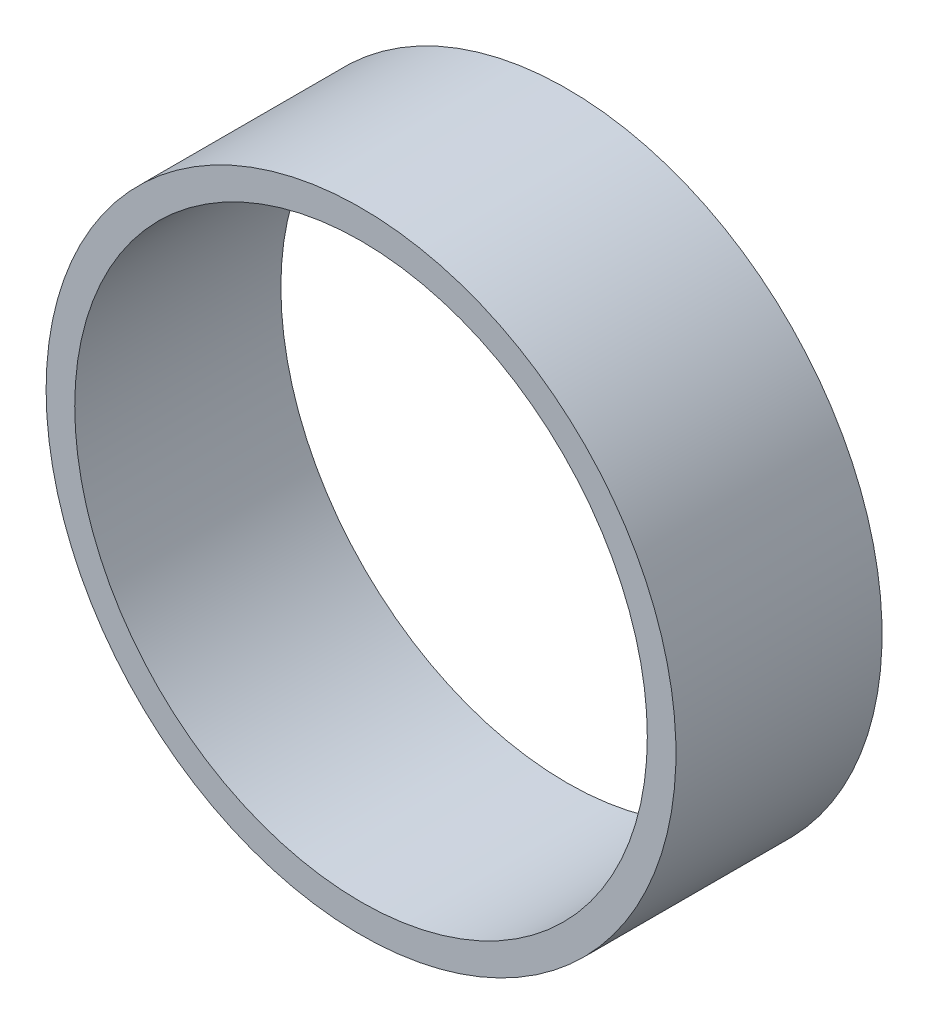
ISO-10303-21;
HEADER;
FILE_DESCRIPTION(('STEP AP214'),'2;1');
FILE_NAME('part.step','',(''),(''),'','','');
FILE_SCHEMA(('AUTOMOTIVE_DESIGN { 1 0 10303 214 1 1 1 1 }'));
ENDSEC;
DATA;
#1=APPLICATION_CONTEXT('core data for automotive mechanical design processes');
#2=APPLICATION_PROTOCOL_DEFINITION('international standard','automotive_design',2000,#1);
#3=PRODUCT_CONTEXT('',#1,'mechanical');
#4=PRODUCT('Part','Part','',(#3));
#5=PRODUCT_RELATED_PRODUCT_CATEGORY('part','',(#4));
#6=PRODUCT_DEFINITION_FORMATION('','',#4);
#7=PRODUCT_DEFINITION_CONTEXT('part definition',#1,'design');
#8=PRODUCT_DEFINITION('design','',#6,#7);
#9=PRODUCT_DEFINITION_SHAPE('','',#8);
#10=(LENGTH_UNIT() NAMED_UNIT(*) SI_UNIT(.MILLI.,.METRE.));
#11=(NAMED_UNIT(*) PLANE_ANGLE_UNIT() SI_UNIT($,.RADIAN.));
#12=(NAMED_UNIT(*) SI_UNIT($,.STERADIAN.) SOLID_ANGLE_UNIT());
#13=UNCERTAINTY_MEASURE_WITH_UNIT(LENGTH_MEASURE(1.E-05),#10,'distance_accuracy_value','');
#14=(GEOMETRIC_REPRESENTATION_CONTEXT(3) GLOBAL_UNCERTAINTY_ASSIGNED_CONTEXT((#13)) GLOBAL_UNIT_ASSIGNED_CONTEXT((#10,
#11,#12)) REPRESENTATION_CONTEXT('',''));
#15=CARTESIAN_POINT('',(0.,0.,0.));
#16=DIRECTION('',(0.,0.,1.));
#17=DIRECTION('',(1.,0.,0.));
#18=AXIS2_PLACEMENT_3D('',#15,#16,#17);
#19=CARTESIAN_POINT('',(0.,0.,-9.00000009344038));
#20=DIRECTION('',(0.,0.,-1.));
#21=DIRECTION('',(-1.,0.,0.));
#22=AXIS2_PLACEMENT_3D('',#19,#20,#21);
#23=CYLINDRICAL_SURFACE('',#22,12.4999999614059);
#24=CARTESIAN_POINT('',(0.,0.,-4.50000009344038));
#25=DIRECTION('',(0.,0.,-1.));
#26=DIRECTION('',(-1.,0.,0.));
#27=AXIS2_PLACEMENT_3D('',#24,#25,#26);
#28=CIRCLE('',#27,12.4999999614059);
#29=CARTESIAN_POINT('',(-12.4999999614059,0.,-4.50000009344038));
#30=VERTEX_POINT('',#29);
#31=EDGE_CURVE('E27',#30,#30,#28,.T.);
#32=ORIENTED_EDGE('',*,*,#31,.F.);
#33=EDGE_LOOP('',(#32));
#34=FACE_BOUND('',#33,.T.);
#35=CARTESIAN_POINT('',(0.,0.,-13.5000000934404));
#36=DIRECTION('',(0.,0.,-1.));
#37=DIRECTION('',(-1.,0.,0.));
#38=AXIS2_PLACEMENT_3D('',#35,#36,#37);
#39=CIRCLE('',#38,12.4999999614059);
#40=CARTESIAN_POINT('',(-12.4999999614059,0.,-13.5000000934404));
#41=VERTEX_POINT('',#40);
#42=EDGE_CURVE('E18',#41,#41,#39,.F.);
#43=ORIENTED_EDGE('',*,*,#42,.F.);
#44=EDGE_LOOP('',(#43));
#45=FACE_BOUND('',#44,.T.);
#46=ADVANCED_FACE('F15',(#34,#45),#23,.F.);
#47=CARTESIAN_POINT('',(0.,12.4999998878747,-13.5000000934404));
#48=DIRECTION('',(0.,0.,-1.));
#49=DIRECTION('',(-1.,0.,0.));
#50=AXIS2_PLACEMENT_3D('',#47,#48,#49);
#51=PLANE('',#50);
#52=ORIENTED_EDGE('',*,*,#42,.T.);
#53=EDGE_LOOP('',(#52));
#54=FACE_BOUND('',#53,.T.);
#55=CARTESIAN_POINT('',(0.,0.,-13.5));
#56=DIRECTION('',(0.,0.,-1.));
#57=DIRECTION('',(-1.,0.,0.));
#58=AXIS2_PLACEMENT_3D('',#55,#56,#57);
#59=CIRCLE('',#58,13.7499999439373);
#60=CARTESIAN_POINT('',(-13.7499999439373,0.,-13.5));
#61=VERTEX_POINT('',#60);
#62=EDGE_CURVE('E22',#61,#61,#59,.F.);
#63=ORIENTED_EDGE('',*,*,#62,.F.);
#64=EDGE_LOOP('',(#63));
#65=FACE_BOUND('',#64,.T.);
#66=ADVANCED_FACE('F35',(#54,#65),#51,.T.);
#67=CARTESIAN_POINT('',(0.,13.75,-4.50000010901333));
#68=DIRECTION('',(0.,0.,1.));
#69=DIRECTION('',(1.,0.,0.));
#70=AXIS2_PLACEMENT_3D('',#67,#68,#69);
#71=PLANE('',#70);
#72=ORIENTED_EDGE('',*,*,#31,.T.);
#73=EDGE_LOOP('',(#72));
#74=FACE_BOUND('',#73,.T.);
#75=CARTESIAN_POINT('',(0.,0.,-4.50000010901333));
#76=DIRECTION('',(0.,0.,-1.));
#77=DIRECTION('',(-1.,0.,0.));
#78=AXIS2_PLACEMENT_3D('',#75,#76,#77);
#79=CIRCLE('',#78,13.7499999439373);
#80=CARTESIAN_POINT('',(-13.7499999439373,0.,-4.50000010901333));
#81=VERTEX_POINT('',#80);
#82=EDGE_CURVE('E10',#81,#81,#79,.T.);
#83=ORIENTED_EDGE('',*,*,#82,.F.);
#84=EDGE_LOOP('',(#83));
#85=FACE_BOUND('',#84,.T.);
#86=ADVANCED_FACE('F44',(#74,#85),#71,.T.);
#87=CARTESIAN_POINT('',(0.,0.,-9.00000005450667));
#88=DIRECTION('',(0.,0.,-1.));
#89=DIRECTION('',(-1.,0.,0.));
#90=AXIS2_PLACEMENT_3D('',#87,#88,#89);
#91=CYLINDRICAL_SURFACE('',#90,13.7499999439373);
#92=ORIENTED_EDGE('',*,*,#82,.T.);
#93=EDGE_LOOP('',(#92));
#94=FACE_BOUND('',#93,.T.);
#95=ORIENTED_EDGE('',*,*,#62,.T.);
#96=EDGE_LOOP('',(#95));
#97=FACE_BOUND('',#96,.T.);
#98=ADVANCED_FACE('F45',(#94,#97),#91,.T.);
#99=CLOSED_SHELL('',(#46,#66,#86,#98));
#100=MANIFOLD_SOLID_BREP('B1',#99);
#101=ADVANCED_BREP_SHAPE_REPRESENTATION('',(#18,#100),#14);
#102=SHAPE_DEFINITION_REPRESENTATION(#9,#101);
ENDSEC;
END-ISO-10303-21;
